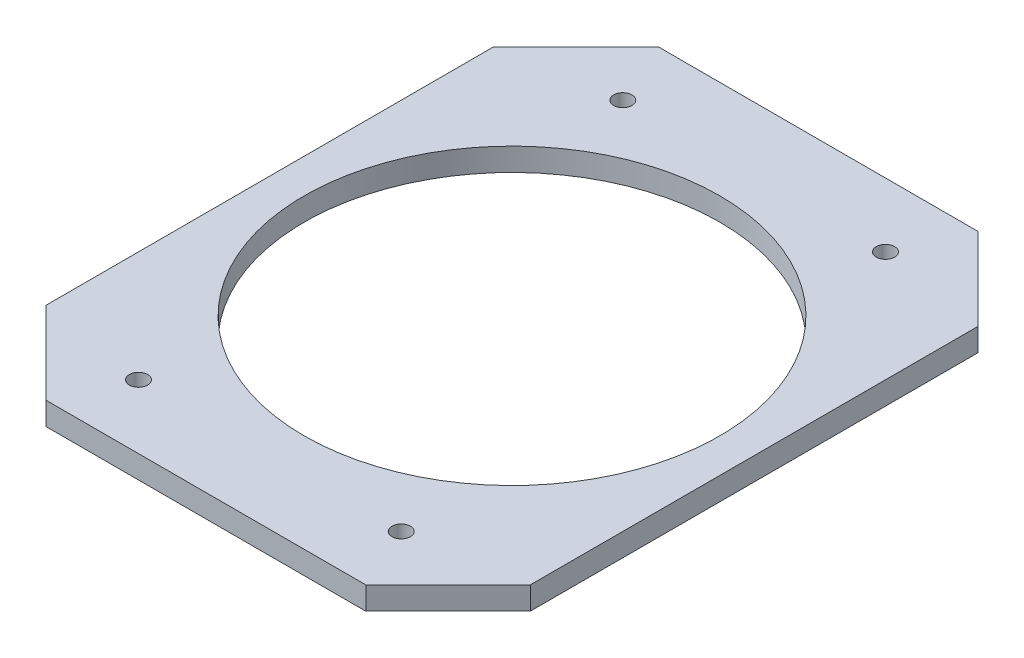
ISO-10303-21;
HEADER;
FILE_DESCRIPTION(('STEP AP214'),'2;1');
FILE_NAME('part.step','',(''),(''),'','','');
FILE_SCHEMA(('AUTOMOTIVE_DESIGN { 1 0 10303 214 1 1 1 1 }'));
ENDSEC;
DATA;
#1=APPLICATION_CONTEXT('core data for automotive mechanical design processes');
#2=APPLICATION_PROTOCOL_DEFINITION('international standard','automotive_design',2000,#1);
#3=PRODUCT_CONTEXT('',#1,'mechanical');
#4=PRODUCT('Part','Part','',(#3));
#5=PRODUCT_RELATED_PRODUCT_CATEGORY('part','',(#4));
#6=PRODUCT_DEFINITION_FORMATION('','',#4);
#7=PRODUCT_DEFINITION_CONTEXT('part definition',#1,'design');
#8=PRODUCT_DEFINITION('design','',#6,#7);
#9=PRODUCT_DEFINITION_SHAPE('','',#8);
#10=(LENGTH_UNIT() NAMED_UNIT(*) SI_UNIT(.MILLI.,.METRE.));
#11=(NAMED_UNIT(*) PLANE_ANGLE_UNIT() SI_UNIT($,.RADIAN.));
#12=(NAMED_UNIT(*) SI_UNIT($,.STERADIAN.) SOLID_ANGLE_UNIT());
#13=UNCERTAINTY_MEASURE_WITH_UNIT(LENGTH_MEASURE(1.E-05),#10,'distance_accuracy_value','');
#14=(GEOMETRIC_REPRESENTATION_CONTEXT(3) GLOBAL_UNCERTAINTY_ASSIGNED_CONTEXT((#13)) GLOBAL_UNIT_ASSIGNED_CONTEXT((#10,
#11,#12)) REPRESENTATION_CONTEXT('',''));
#15=CARTESIAN_POINT('',(0.,0.,0.));
#16=DIRECTION('',(0.,0.,1.));
#17=DIRECTION('',(1.,0.,0.));
#18=AXIS2_PLACEMENT_3D('',#15,#16,#17);
#19=CARTESIAN_POINT('',(-67.31,6.35,62.23));
#20=DIRECTION('',(1.,0.,0.));
#21=DIRECTION('',(0.,0.,-1.));
#22=AXIS2_PLACEMENT_3D('',#19,#20,#21);
#23=PLANE('',#22);
#24=DIRECTION('',(0.,0.,1.));
#25=VECTOR('',#24,1.);
#26=CARTESIAN_POINT('',(-67.31,0.,62.23));
#27=LINE('',#26,#25);
#28=CARTESIAN_POINT('',(-67.31,0.,-62.23));
#29=VERTEX_POINT('',#28);
#30=CARTESIAN_POINT('',(-67.31,0.,62.23));
#31=VERTEX_POINT('',#30);
#32=EDGE_CURVE('E129',#29,#31,#27,.T.);
#33=ORIENTED_EDGE('',*,*,#32,.T.);
#34=DIRECTION('',(0.,-1.,0.));
#35=VECTOR('',#34,1.);
#36=CARTESIAN_POINT('',(-67.31,6.35,62.23));
#37=LINE('',#36,#35);
#38=CARTESIAN_POINT('',(-67.31,6.35,62.23));
#39=VERTEX_POINT('',#38);
#40=EDGE_CURVE('E11',#39,#31,#37,.T.);
#41=ORIENTED_EDGE('',*,*,#40,.F.);
#42=DIRECTION('',(0.,0.,1.));
#43=VECTOR('',#42,1.);
#44=CARTESIAN_POINT('',(-67.31,6.35,62.23));
#45=LINE('',#44,#43);
#46=CARTESIAN_POINT('',(-67.31,6.35,-62.23));
#47=VERTEX_POINT('',#46);
#48=EDGE_CURVE('E144',#47,#39,#45,.T.);
#49=ORIENTED_EDGE('',*,*,#48,.F.);
#50=DIRECTION('',(0.,-1.,0.));
#51=VECTOR('',#50,1.);
#52=CARTESIAN_POINT('',(-67.31,6.35,-62.23));
#53=LINE('',#52,#51);
#54=EDGE_CURVE('E125',#47,#29,#53,.T.);
#55=ORIENTED_EDGE('',*,*,#54,.T.);
#56=EDGE_LOOP('',(#33,#41,#49,#55));
#57=FACE_BOUND('',#56,.T.);
#58=ADVANCED_FACE('F33',(#57),#23,.F.);
#59=CARTESIAN_POINT('',(-67.31,6.35,62.23));
#60=DIRECTION('',(0.707106781186548,0.,-0.707106781186547));
#61=DIRECTION('',(-0.707106781186547,0.,-0.707106781186548));
#62=AXIS2_PLACEMENT_3D('',#59,#60,#61);
#63=PLANE('',#62);
#64=DIRECTION('',(0.707106781186547,0.,0.707106781186548));
#65=VECTOR('',#64,1.);
#66=CARTESIAN_POINT('',(-67.31,0.,62.23));
#67=LINE('',#66,#65);
#68=CARTESIAN_POINT('',(-44.45,0.,85.09));
#69=VERTEX_POINT('',#68);
#70=EDGE_CURVE('E132',#31,#69,#67,.T.);
#71=ORIENTED_EDGE('',*,*,#70,.T.);
#72=DIRECTION('',(0.,-1.,0.));
#73=VECTOR('',#72,1.);
#74=CARTESIAN_POINT('',(-44.45,6.35,85.09));
#75=LINE('',#74,#73);
#76=CARTESIAN_POINT('',(-44.45,6.35,85.09));
#77=VERTEX_POINT('',#76);
#78=EDGE_CURVE('E41',#77,#69,#75,.T.);
#79=ORIENTED_EDGE('',*,*,#78,.F.);
#80=DIRECTION('',(0.707106781186547,0.,0.707106781186548));
#81=VECTOR('',#80,1.);
#82=CARTESIAN_POINT('',(-67.31,6.35,62.23));
#83=LINE('',#82,#81);
#84=EDGE_CURVE('E92',#39,#77,#83,.T.);
#85=ORIENTED_EDGE('',*,*,#84,.F.);
#86=ORIENTED_EDGE('',*,*,#40,.T.);
#87=EDGE_LOOP('',(#71,#79,#85,#86));
#88=FACE_BOUND('',#87,.T.);
#89=ADVANCED_FACE('F243',(#88),#63,.F.);
#90=CARTESIAN_POINT('',(-44.45,6.35,85.09));
#91=DIRECTION('',(0.,0.,-1.));
#92=DIRECTION('',(-1.,0.,0.));
#93=AXIS2_PLACEMENT_3D('',#90,#91,#92);
#94=PLANE('',#93);
#95=DIRECTION('',(1.,0.,0.));
#96=VECTOR('',#95,1.);
#97=CARTESIAN_POINT('',(-44.45,0.,85.09));
#98=LINE('',#97,#96);
#99=CARTESIAN_POINT('',(44.45,0.,85.09));
#100=VERTEX_POINT('',#99);
#101=EDGE_CURVE('E135',#69,#100,#98,.T.);
#102=ORIENTED_EDGE('',*,*,#101,.T.);
#103=DIRECTION('',(0.,-1.,0.));
#104=VECTOR('',#103,1.);
#105=CARTESIAN_POINT('',(44.45,6.35,85.09));
#106=LINE('',#105,#104);
#107=CARTESIAN_POINT('',(44.45,6.35,85.09));
#108=VERTEX_POINT('',#107);
#109=EDGE_CURVE('E151',#108,#100,#106,.T.);
#110=ORIENTED_EDGE('',*,*,#109,.F.);
#111=DIRECTION('',(1.,0.,0.));
#112=VECTOR('',#111,1.);
#113=CARTESIAN_POINT('',(-44.45,6.35,85.09));
#114=LINE('',#113,#112);
#115=EDGE_CURVE('E159',#77,#108,#114,.T.);
#116=ORIENTED_EDGE('',*,*,#115,.F.);
#117=ORIENTED_EDGE('',*,*,#78,.T.);
#118=EDGE_LOOP('',(#102,#110,#116,#117));
#119=FACE_BOUND('',#118,.T.);
#120=ADVANCED_FACE('F157',(#119),#94,.F.);
#121=CARTESIAN_POINT('',(67.31,6.35,62.23));
#122=DIRECTION('',(-0.707106781186548,0.,-0.707106781186547));
#123=DIRECTION('',(-0.707106781186547,0.,0.707106781186548));
#124=AXIS2_PLACEMENT_3D('',#121,#122,#123);
#125=PLANE('',#124);
#126=DIRECTION('',(0.707106781186547,0.,-0.707106781186548));
#127=VECTOR('',#126,1.);
#128=CARTESIAN_POINT('',(67.31,0.,62.23));
#129=LINE('',#128,#127);
#130=CARTESIAN_POINT('',(67.31,0.,62.23));
#131=VERTEX_POINT('',#130);
#132=EDGE_CURVE('E137',#100,#131,#129,.T.);
#133=ORIENTED_EDGE('',*,*,#132,.T.);
#134=DIRECTION('',(0.,-1.,0.));
#135=VECTOR('',#134,1.);
#136=CARTESIAN_POINT('',(67.31,6.35,62.23));
#137=LINE('',#136,#135);
#138=CARTESIAN_POINT('',(67.31,6.35,62.23));
#139=VERTEX_POINT('',#138);
#140=EDGE_CURVE('E148',#139,#131,#137,.T.);
#141=ORIENTED_EDGE('',*,*,#140,.F.);
#142=DIRECTION('',(0.707106781186547,0.,-0.707106781186548));
#143=VECTOR('',#142,1.);
#144=CARTESIAN_POINT('',(67.31,6.35,62.23));
#145=LINE('',#144,#143);
#146=EDGE_CURVE('E171',#108,#139,#145,.T.);
#147=ORIENTED_EDGE('',*,*,#146,.F.);
#148=ORIENTED_EDGE('',*,*,#109,.T.);
#149=EDGE_LOOP('',(#133,#141,#147,#148));
#150=FACE_BOUND('',#149,.T.);
#151=ADVANCED_FACE('F167',(#150),#125,.F.);
#152=CARTESIAN_POINT('',(67.31,6.35,62.23));
#153=DIRECTION('',(-1.,0.,0.));
#154=DIRECTION('',(0.,0.,1.));
#155=AXIS2_PLACEMENT_3D('',#152,#153,#154);
#156=PLANE('',#155);
#157=DIRECTION('',(0.,0.,-1.));
#158=VECTOR('',#157,1.);
#159=CARTESIAN_POINT('',(67.31,0.,62.23));
#160=LINE('',#159,#158);
#161=CARTESIAN_POINT('',(67.31,0.,-62.23));
#162=VERTEX_POINT('',#161);
#163=EDGE_CURVE('E139',#131,#162,#160,.T.);
#164=ORIENTED_EDGE('',*,*,#163,.T.);
#165=DIRECTION('',(0.,-1.,0.));
#166=VECTOR('',#165,1.);
#167=CARTESIAN_POINT('',(67.31,6.35,-62.23));
#168=LINE('',#167,#166);
#169=CARTESIAN_POINT('',(67.31,6.35,-62.23));
#170=VERTEX_POINT('',#169);
#171=EDGE_CURVE('E120',#170,#162,#168,.T.);
#172=ORIENTED_EDGE('',*,*,#171,.F.);
#173=DIRECTION('',(0.,0.,-1.));
#174=VECTOR('',#173,1.);
#175=CARTESIAN_POINT('',(67.31,6.35,62.23));
#176=LINE('',#175,#174);
#177=EDGE_CURVE('E111',#139,#170,#176,.T.);
#178=ORIENTED_EDGE('',*,*,#177,.F.);
#179=ORIENTED_EDGE('',*,*,#140,.T.);
#180=EDGE_LOOP('',(#164,#172,#178,#179));
#181=FACE_BOUND('',#180,.T.);
#182=ADVANCED_FACE('F170',(#181),#156,.F.);
#183=CARTESIAN_POINT('',(44.45,6.35,-85.09));
#184=DIRECTION('',(-0.707106781186548,0.,0.707106781186547));
#185=DIRECTION('',(0.707106781186547,0.,0.707106781186548));
#186=AXIS2_PLACEMENT_3D('',#183,#184,#185);
#187=PLANE('',#186);
#188=DIRECTION('',(-0.707106781186547,0.,-0.707106781186548));
#189=VECTOR('',#188,1.);
#190=CARTESIAN_POINT('',(44.45,0.,-85.09));
#191=LINE('',#190,#189);
#192=CARTESIAN_POINT('',(44.45,0.,-85.09));
#193=VERTEX_POINT('',#192);
#194=EDGE_CURVE('E119',#162,#193,#191,.T.);
#195=ORIENTED_EDGE('',*,*,#194,.T.);
#196=DIRECTION('',(0.,-1.,0.));
#197=VECTOR('',#196,1.);
#198=CARTESIAN_POINT('',(44.45,6.35,-85.09));
#199=LINE('',#198,#197);
#200=CARTESIAN_POINT('',(44.45,6.35,-85.09));
#201=VERTEX_POINT('',#200);
#202=EDGE_CURVE('E116',#201,#193,#199,.T.);
#203=ORIENTED_EDGE('',*,*,#202,.F.);
#204=DIRECTION('',(-0.707106781186547,0.,-0.707106781186548));
#205=VECTOR('',#204,1.);
#206=CARTESIAN_POINT('',(44.45,6.35,-85.09));
#207=LINE('',#206,#205);
#208=EDGE_CURVE('E105',#170,#201,#207,.T.);
#209=ORIENTED_EDGE('',*,*,#208,.F.);
#210=ORIENTED_EDGE('',*,*,#171,.T.);
#211=EDGE_LOOP('',(#195,#203,#209,#210));
#212=FACE_BOUND('',#211,.T.);
#213=ADVANCED_FACE('F117',(#212),#187,.F.);
#214=CARTESIAN_POINT('',(-44.45,6.35,-85.09));
#215=DIRECTION('',(0.,0.,1.));
#216=DIRECTION('',(1.,0.,0.));
#217=AXIS2_PLACEMENT_3D('',#214,#215,#216);
#218=PLANE('',#217);
#219=DIRECTION('',(-1.,0.,0.));
#220=VECTOR('',#219,1.);
#221=CARTESIAN_POINT('',(-44.45,0.,-85.09));
#222=LINE('',#221,#220);
#223=CARTESIAN_POINT('',(-44.45,0.,-85.09));
#224=VERTEX_POINT('',#223);
#225=EDGE_CURVE('E78',#193,#224,#222,.T.);
#226=ORIENTED_EDGE('',*,*,#225,.T.);
#227=DIRECTION('',(0.,-1.,0.));
#228=VECTOR('',#227,1.);
#229=CARTESIAN_POINT('',(-44.45,6.35,-85.09));
#230=LINE('',#229,#228);
#231=CARTESIAN_POINT('',(-44.45,6.35,-85.09));
#232=VERTEX_POINT('',#231);
#233=EDGE_CURVE('E121',#232,#224,#230,.T.);
#234=ORIENTED_EDGE('',*,*,#233,.F.);
#235=DIRECTION('',(-1.,0.,0.));
#236=VECTOR('',#235,1.);
#237=CARTESIAN_POINT('',(-44.45,6.35,-85.09));
#238=LINE('',#237,#236);
#239=EDGE_CURVE('E109',#201,#232,#238,.T.);
#240=ORIENTED_EDGE('',*,*,#239,.F.);
#241=ORIENTED_EDGE('',*,*,#202,.T.);
#242=EDGE_LOOP('',(#226,#234,#240,#241));
#243=FACE_BOUND('',#242,.T.);
#244=ADVANCED_FACE('F123',(#243),#218,.F.);
#245=CARTESIAN_POINT('',(-67.31,6.35,-62.23));
#246=DIRECTION('',(0.707106781186548,0.,0.707106781186548));
#247=DIRECTION('',(0.707106781186548,0.,-0.707106781186548));
#248=AXIS2_PLACEMENT_3D('',#245,#246,#247);
#249=PLANE('',#248);
#250=DIRECTION('',(-0.707106781186547,0.,0.707106781186547));
#251=VECTOR('',#250,1.);
#252=CARTESIAN_POINT('',(-67.31,0.,-62.23));
#253=LINE('',#252,#251);
#254=EDGE_CURVE('E84',#224,#29,#253,.T.);
#255=ORIENTED_EDGE('',*,*,#254,.T.);
#256=ORIENTED_EDGE('',*,*,#54,.F.);
#257=DIRECTION('',(-0.707106781186547,0.,0.707106781186547));
#258=VECTOR('',#257,1.);
#259=CARTESIAN_POINT('',(-67.31,6.35,-62.23));
#260=LINE('',#259,#258);
#261=EDGE_CURVE('E49',#232,#47,#260,.T.);
#262=ORIENTED_EDGE('',*,*,#261,.F.);
#263=ORIENTED_EDGE('',*,*,#233,.T.);
#264=EDGE_LOOP('',(#255,#256,#262,#263));
#265=FACE_BOUND('',#264,.T.);
#266=ADVANCED_FACE('F218',(#265),#249,.F.);
#267=CARTESIAN_POINT('',(-67.31,6.35,-85.09));
#268=DIRECTION('',(0.,-1.,0.));
#269=DIRECTION('',(0.,0.,-1.));
#270=AXIS2_PLACEMENT_3D('',#267,#268,#269);
#271=PLANE('',#270);
#272=CARTESIAN_POINT('',(0.,6.35,0.));
#273=DIRECTION('',(0.,1.,0.));
#274=DIRECTION('',(0.,0.,1.));
#275=AXIS2_PLACEMENT_3D('',#272,#273,#274);
#276=CIRCLE('',#275,57.785);
#277=CARTESIAN_POINT('',(0.,6.35,57.785));
#278=VERTEX_POINT('',#277);
#279=EDGE_CURVE('E201',#278,#278,#276,.T.);
#280=ORIENTED_EDGE('',*,*,#279,.F.);
#281=EDGE_LOOP('',(#280));
#282=FACE_BOUND('',#281,.T.);
#283=CARTESIAN_POINT('',(36.5125,6.35,67.31));
#284=DIRECTION('',(0.,1.,0.));
#285=DIRECTION('',(0.,0.,1.));
#286=AXIS2_PLACEMENT_3D('',#283,#284,#285);
#287=CIRCLE('',#286,2.5527);
#288=CARTESIAN_POINT('',(36.5125,6.35,69.8627));
#289=VERTEX_POINT('',#288);
#290=EDGE_CURVE('E197',#289,#289,#287,.T.);
#291=ORIENTED_EDGE('',*,*,#290,.F.);
#292=EDGE_LOOP('',(#291));
#293=FACE_BOUND('',#292,.T.);
#294=CARTESIAN_POINT('',(-36.5125,6.35,67.31));
#295=DIRECTION('',(0.,1.,0.));
#296=DIRECTION('',(0.,0.,1.));
#297=AXIS2_PLACEMENT_3D('',#294,#295,#296);
#298=CIRCLE('',#297,2.5527);
#299=CARTESIAN_POINT('',(-36.5125,6.35,69.8627));
#300=VERTEX_POINT('',#299);
#301=EDGE_CURVE('E191',#300,#300,#298,.T.);
#302=ORIENTED_EDGE('',*,*,#301,.F.);
#303=EDGE_LOOP('',(#302));
#304=FACE_BOUND('',#303,.T.);
#305=CARTESIAN_POINT('',(-36.5125,6.35,-67.31));
#306=DIRECTION('',(0.,1.,0.));
#307=DIRECTION('',(0.,0.,1.));
#308=AXIS2_PLACEMENT_3D('',#305,#306,#307);
#309=CIRCLE('',#308,2.5527);
#310=CARTESIAN_POINT('',(-36.5125,6.35,-64.7573));
#311=VERTEX_POINT('',#310);
#312=EDGE_CURVE('E185',#311,#311,#309,.T.);
#313=ORIENTED_EDGE('',*,*,#312,.F.);
#314=EDGE_LOOP('',(#313));
#315=FACE_BOUND('',#314,.T.);
#316=CARTESIAN_POINT('',(36.5125,6.35,-67.31));
#317=DIRECTION('',(0.,1.,0.));
#318=DIRECTION('',(0.,0.,1.));
#319=AXIS2_PLACEMENT_3D('',#316,#317,#318);
#320=CIRCLE('',#319,2.5527);
#321=CARTESIAN_POINT('',(36.5125,6.35,-64.7573));
#322=VERTEX_POINT('',#321);
#323=EDGE_CURVE('E179',#322,#322,#320,.T.);
#324=ORIENTED_EDGE('',*,*,#323,.F.);
#325=EDGE_LOOP('',(#324));
#326=FACE_BOUND('',#325,.T.);
#327=ORIENTED_EDGE('',*,*,#48,.T.);
#328=ORIENTED_EDGE('',*,*,#84,.T.);
#329=ORIENTED_EDGE('',*,*,#115,.T.);
#330=ORIENTED_EDGE('',*,*,#146,.T.);
#331=ORIENTED_EDGE('',*,*,#177,.T.);
#332=ORIENTED_EDGE('',*,*,#208,.T.);
#333=ORIENTED_EDGE('',*,*,#239,.T.);
#334=ORIENTED_EDGE('',*,*,#261,.T.);
#335=EDGE_LOOP('',(#327,#328,#329,#330,#331,#332,#333,#334));
#336=FACE_BOUND('',#335,.T.);
#337=ADVANCED_FACE('F107',(#282,#293,#304,#315,#326,#336),#271,.F.);
#338=CARTESIAN_POINT('',(-67.31,0.,-85.09));
#339=DIRECTION('',(0.,-1.,0.));
#340=DIRECTION('',(0.,0.,-1.));
#341=AXIS2_PLACEMENT_3D('',#338,#339,#340);
#342=PLANE('',#341);
#343=CARTESIAN_POINT('',(0.,0.,0.));
#344=DIRECTION('',(0.,1.,0.));
#345=DIRECTION('',(0.,0.,1.));
#346=AXIS2_PLACEMENT_3D('',#343,#344,#345);
#347=CIRCLE('',#346,57.785);
#348=CARTESIAN_POINT('',(0.,0.,57.785));
#349=VERTEX_POINT('',#348);
#350=EDGE_CURVE('E200',#349,#349,#347,.T.);
#351=ORIENTED_EDGE('',*,*,#350,.T.);
#352=EDGE_LOOP('',(#351));
#353=FACE_BOUND('',#352,.T.);
#354=CARTESIAN_POINT('',(36.5125,0.,67.31));
#355=DIRECTION('',(0.,1.,0.));
#356=DIRECTION('',(0.,0.,1.));
#357=AXIS2_PLACEMENT_3D('',#354,#355,#356);
#358=CIRCLE('',#357,2.5527);
#359=CARTESIAN_POINT('',(36.5125,0.,69.8627));
#360=VERTEX_POINT('',#359);
#361=EDGE_CURVE('E194',#360,#360,#358,.T.);
#362=ORIENTED_EDGE('',*,*,#361,.T.);
#363=EDGE_LOOP('',(#362));
#364=FACE_BOUND('',#363,.T.);
#365=CARTESIAN_POINT('',(-36.5125,0.,67.31));
#366=DIRECTION('',(0.,1.,0.));
#367=DIRECTION('',(0.,0.,1.));
#368=AXIS2_PLACEMENT_3D('',#365,#366,#367);
#369=CIRCLE('',#368,2.5527);
#370=CARTESIAN_POINT('',(-36.5125,0.,69.8627));
#371=VERTEX_POINT('',#370);
#372=EDGE_CURVE('E188',#371,#371,#369,.T.);
#373=ORIENTED_EDGE('',*,*,#372,.T.);
#374=EDGE_LOOP('',(#373));
#375=FACE_BOUND('',#374,.T.);
#376=CARTESIAN_POINT('',(-36.5125,0.,-67.31));
#377=DIRECTION('',(0.,1.,0.));
#378=DIRECTION('',(0.,0.,1.));
#379=AXIS2_PLACEMENT_3D('',#376,#377,#378);
#380=CIRCLE('',#379,2.5527);
#381=CARTESIAN_POINT('',(-36.5125,0.,-64.7573));
#382=VERTEX_POINT('',#381);
#383=EDGE_CURVE('E182',#382,#382,#380,.T.);
#384=ORIENTED_EDGE('',*,*,#383,.T.);
#385=EDGE_LOOP('',(#384));
#386=FACE_BOUND('',#385,.T.);
#387=CARTESIAN_POINT('',(36.5125,0.,-67.31));
#388=DIRECTION('',(0.,1.,0.));
#389=DIRECTION('',(0.,0.,1.));
#390=AXIS2_PLACEMENT_3D('',#387,#388,#389);
#391=CIRCLE('',#390,2.5527);
#392=CARTESIAN_POINT('',(36.5125,0.,-64.7573));
#393=VERTEX_POINT('',#392);
#394=EDGE_CURVE('E133',#393,#393,#391,.T.);
#395=ORIENTED_EDGE('',*,*,#394,.T.);
#396=EDGE_LOOP('',(#395));
#397=FACE_BOUND('',#396,.T.);
#398=ORIENTED_EDGE('',*,*,#32,.F.);
#399=ORIENTED_EDGE('',*,*,#254,.F.);
#400=ORIENTED_EDGE('',*,*,#225,.F.);
#401=ORIENTED_EDGE('',*,*,#194,.F.);
#402=ORIENTED_EDGE('',*,*,#163,.F.);
#403=ORIENTED_EDGE('',*,*,#132,.F.);
#404=ORIENTED_EDGE('',*,*,#101,.F.);
#405=ORIENTED_EDGE('',*,*,#70,.F.);
#406=EDGE_LOOP('',(#398,#399,#400,#401,#402,#403,#404,#405));
#407=FACE_BOUND('',#406,.T.);
#408=ADVANCED_FACE('F163',(#353,#364,#375,#386,#397,#407),#342,.T.);
#409=CARTESIAN_POINT('',(36.5125,6.35,-67.31));
#410=DIRECTION('',(0.,1.,0.));
#411=DIRECTION('',(0.,0.,1.));
#412=AXIS2_PLACEMENT_3D('',#409,#410,#411);
#413=CYLINDRICAL_SURFACE('',#412,2.5527);
#414=ORIENTED_EDGE('',*,*,#394,.F.);
#415=EDGE_LOOP('',(#414));
#416=FACE_BOUND('',#415,.T.);
#417=ORIENTED_EDGE('',*,*,#323,.T.);
#418=EDGE_LOOP('',(#417));
#419=FACE_BOUND('',#418,.T.);
#420=ADVANCED_FACE('F228',(#416,#419),#413,.F.);
#421=CARTESIAN_POINT('',(-36.5125,6.35,-67.31));
#422=DIRECTION('',(0.,1.,0.));
#423=DIRECTION('',(0.,0.,1.));
#424=AXIS2_PLACEMENT_3D('',#421,#422,#423);
#425=CYLINDRICAL_SURFACE('',#424,2.5527);
#426=ORIENTED_EDGE('',*,*,#383,.F.);
#427=EDGE_LOOP('',(#426));
#428=FACE_BOUND('',#427,.T.);
#429=ORIENTED_EDGE('',*,*,#312,.T.);
#430=EDGE_LOOP('',(#429));
#431=FACE_BOUND('',#430,.T.);
#432=ADVANCED_FACE('F230',(#428,#431),#425,.F.);
#433=CARTESIAN_POINT('',(-36.5125,6.35,67.31));
#434=DIRECTION('',(0.,1.,0.));
#435=DIRECTION('',(0.,0.,1.));
#436=AXIS2_PLACEMENT_3D('',#433,#434,#435);
#437=CYLINDRICAL_SURFACE('',#436,2.5527);
#438=ORIENTED_EDGE('',*,*,#372,.F.);
#439=EDGE_LOOP('',(#438));
#440=FACE_BOUND('',#439,.T.);
#441=ORIENTED_EDGE('',*,*,#301,.T.);
#442=EDGE_LOOP('',(#441));
#443=FACE_BOUND('',#442,.T.);
#444=ADVANCED_FACE('F237',(#440,#443),#437,.F.);
#445=CARTESIAN_POINT('',(36.5125,6.35,67.31));
#446=DIRECTION('',(0.,1.,0.));
#447=DIRECTION('',(0.,0.,1.));
#448=AXIS2_PLACEMENT_3D('',#445,#446,#447);
#449=CYLINDRICAL_SURFACE('',#448,2.5527);
#450=ORIENTED_EDGE('',*,*,#361,.F.);
#451=EDGE_LOOP('',(#450));
#452=FACE_BOUND('',#451,.T.);
#453=ORIENTED_EDGE('',*,*,#290,.T.);
#454=EDGE_LOOP('',(#453));
#455=FACE_BOUND('',#454,.T.);
#456=ADVANCED_FACE('F212',(#452,#455),#449,.F.);
#457=CARTESIAN_POINT('',(0.,0.,0.));
#458=DIRECTION('',(0.,1.,0.));
#459=DIRECTION('',(0.,0.,1.));
#460=AXIS2_PLACEMENT_3D('',#457,#458,#459);
#461=CYLINDRICAL_SURFACE('',#460,57.785);
#462=ORIENTED_EDGE('',*,*,#350,.F.);
#463=EDGE_LOOP('',(#462));
#464=FACE_BOUND('',#463,.T.);
#465=ORIENTED_EDGE('',*,*,#279,.T.);
#466=EDGE_LOOP('',(#465));
#467=FACE_BOUND('',#466,.T.);
#468=ADVANCED_FACE('F209',(#464,#467),#461,.F.);
#469=CLOSED_SHELL('',(#58,#89,#120,#151,#182,#213,#244,#266,#337,#408,#420,#432,#444,#456,#468));
#470=MANIFOLD_SOLID_BREP('B2',#469);
#471=ADVANCED_BREP_SHAPE_REPRESENTATION('',(#18,#470),#14);
#472=SHAPE_DEFINITION_REPRESENTATION(#9,#471);
ENDSEC;
END-ISO-10303-21;
